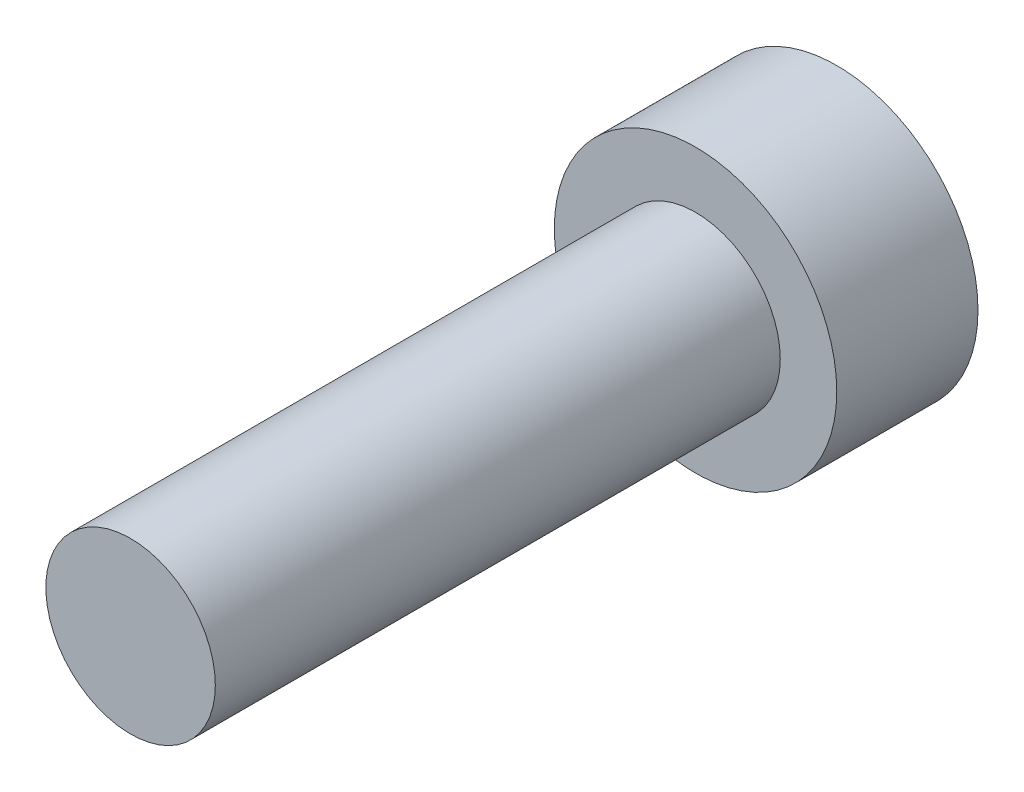
ISO-10303-21;
HEADER;
FILE_DESCRIPTION(('STEP AP214'),'2;1');
FILE_NAME('part.step','',(''),(''),'','','');
FILE_SCHEMA(('AUTOMOTIVE_DESIGN { 1 0 10303 214 1 1 1 1 }'));
ENDSEC;
DATA;
#1=APPLICATION_CONTEXT('core data for automotive mechanical design processes');
#2=APPLICATION_PROTOCOL_DEFINITION('international standard','automotive_design',2000,#1);
#3=PRODUCT_CONTEXT('',#1,'mechanical');
#4=PRODUCT('Part','Part','',(#3));
#5=PRODUCT_RELATED_PRODUCT_CATEGORY('part','',(#4));
#6=PRODUCT_DEFINITION_FORMATION('','',#4);
#7=PRODUCT_DEFINITION_CONTEXT('part definition',#1,'design');
#8=PRODUCT_DEFINITION('design','',#6,#7);
#9=PRODUCT_DEFINITION_SHAPE('','',#8);
#10=(LENGTH_UNIT() NAMED_UNIT(*) SI_UNIT(.MILLI.,.METRE.));
#11=(NAMED_UNIT(*) PLANE_ANGLE_UNIT() SI_UNIT($,.RADIAN.));
#12=(NAMED_UNIT(*) SI_UNIT($,.STERADIAN.) SOLID_ANGLE_UNIT());
#13=UNCERTAINTY_MEASURE_WITH_UNIT(LENGTH_MEASURE(1.E-05),#10,'distance_accuracy_value','');
#14=(GEOMETRIC_REPRESENTATION_CONTEXT(3) GLOBAL_UNCERTAINTY_ASSIGNED_CONTEXT((#13)) GLOBAL_UNIT_ASSIGNED_CONTEXT((#10,
#11,#12)) REPRESENTATION_CONTEXT('',''));
#15=CARTESIAN_POINT('',(0.,0.,0.));
#16=DIRECTION('',(0.,0.,1.));
#17=DIRECTION('',(1.,0.,0.));
#18=AXIS2_PLACEMENT_3D('',#15,#16,#17);
#19=CARTESIAN_POINT('',(0.,0.,0.));
#20=DIRECTION('',(0.,0.,1.));
#21=DIRECTION('',(1.,0.,0.));
#22=AXIS2_PLACEMENT_3D('',#19,#20,#21);
#23=PLANE('',#22);
#24=CARTESIAN_POINT('',(0.,0.,0.));
#25=DIRECTION('',(0.,0.,1.));
#26=DIRECTION('',(1.,0.,0.));
#27=AXIS2_PLACEMENT_3D('',#24,#25,#26);
#28=CIRCLE('',#27,2.5);
#29=CARTESIAN_POINT('',(2.5,0.,0.));
#30=VERTEX_POINT('',#29);
#31=EDGE_CURVE('E39',#30,#30,#28,.T.);
#32=ORIENTED_EDGE('',*,*,#31,.T.);
#33=EDGE_LOOP('',(#32));
#34=FACE_BOUND('',#33,.T.);
#35=CARTESIAN_POINT('',(0.,0.,0.));
#36=DIRECTION('',(0.,0.,1.));
#37=DIRECTION('',(1.,0.,0.));
#38=AXIS2_PLACEMENT_3D('',#35,#36,#37);
#39=CIRCLE('',#38,1.5);
#40=CARTESIAN_POINT('',(1.5,0.,0.));
#41=VERTEX_POINT('',#40);
#42=EDGE_CURVE('E48',#41,#41,#39,.T.);
#43=ORIENTED_EDGE('',*,*,#42,.F.);
#44=EDGE_LOOP('',(#43));
#45=FACE_BOUND('',#44,.T.);
#46=ADVANCED_FACE('F35',(#34,#45),#23,.T.);
#47=CARTESIAN_POINT('',(0.,0.,-2.5));
#48=DIRECTION('',(0.,0.,1.));
#49=DIRECTION('',(1.,0.,0.));
#50=AXIS2_PLACEMENT_3D('',#47,#48,#49);
#51=CYLINDRICAL_SURFACE('',#50,2.5);
#52=CARTESIAN_POINT('',(0.,0.,-2.5));
#53=DIRECTION('',(0.,0.,1.));
#54=DIRECTION('',(1.,0.,0.));
#55=AXIS2_PLACEMENT_3D('',#52,#53,#54);
#56=CIRCLE('',#55,2.5);
#57=CARTESIAN_POINT('',(2.5,0.,-2.5));
#58=VERTEX_POINT('',#57);
#59=EDGE_CURVE('E10',#58,#58,#56,.T.);
#60=ORIENTED_EDGE('',*,*,#59,.T.);
#61=EDGE_LOOP('',(#60));
#62=FACE_BOUND('',#61,.T.);
#63=ORIENTED_EDGE('',*,*,#31,.F.);
#64=EDGE_LOOP('',(#63));
#65=FACE_BOUND('',#64,.T.);
#66=ADVANCED_FACE('F37',(#62,#65),#51,.T.);
#67=CARTESIAN_POINT('',(0.,0.,-2.5));
#68=DIRECTION('',(0.,0.,1.));
#69=DIRECTION('',(1.,0.,0.));
#70=AXIS2_PLACEMENT_3D('',#67,#68,#69);
#71=PLANE('',#70);
#72=ORIENTED_EDGE('',*,*,#59,.F.);
#73=EDGE_LOOP('',(#72));
#74=FACE_BOUND('',#73,.T.);
#75=ADVANCED_FACE('F59',(#74),#71,.F.);
#76=CARTESIAN_POINT('',(0.,0.,10.));
#77=DIRECTION('',(0.,0.,-1.));
#78=DIRECTION('',(-1.,0.,0.));
#79=AXIS2_PLACEMENT_3D('',#76,#77,#78);
#80=CYLINDRICAL_SURFACE('',#79,1.5);
#81=CARTESIAN_POINT('',(0.,0.,10.));
#82=DIRECTION('',(0.,0.,1.));
#83=DIRECTION('',(1.,0.,0.));
#84=AXIS2_PLACEMENT_3D('',#81,#82,#83);
#85=CIRCLE('',#84,1.5);
#86=CARTESIAN_POINT('',(1.5,0.,10.));
#87=VERTEX_POINT('',#86);
#88=EDGE_CURVE('E46',#87,#87,#85,.T.);
#89=ORIENTED_EDGE('',*,*,#88,.F.);
#90=EDGE_LOOP('',(#89));
#91=FACE_BOUND('',#90,.T.);
#92=ORIENTED_EDGE('',*,*,#42,.T.);
#93=EDGE_LOOP('',(#92));
#94=FACE_BOUND('',#93,.T.);
#95=ADVANCED_FACE('F56',(#91,#94),#80,.T.);
#96=CARTESIAN_POINT('',(0.,0.,10.));
#97=DIRECTION('',(0.,0.,1.));
#98=DIRECTION('',(1.,0.,0.));
#99=AXIS2_PLACEMENT_3D('',#96,#97,#98);
#100=PLANE('',#99);
#101=ORIENTED_EDGE('',*,*,#88,.T.);
#102=EDGE_LOOP('',(#101));
#103=FACE_BOUND('',#102,.T.);
#104=ADVANCED_FACE('F54',(#103),#100,.T.);
#105=CLOSED_SHELL('',(#46,#66,#75,#95,#104));
#106=MANIFOLD_SOLID_BREP('B2',#105);
#107=ADVANCED_BREP_SHAPE_REPRESENTATION('',(#18,#106),#14);
#108=SHAPE_DEFINITION_REPRESENTATION(#9,#107);
ENDSEC;
END-ISO-10303-21;
